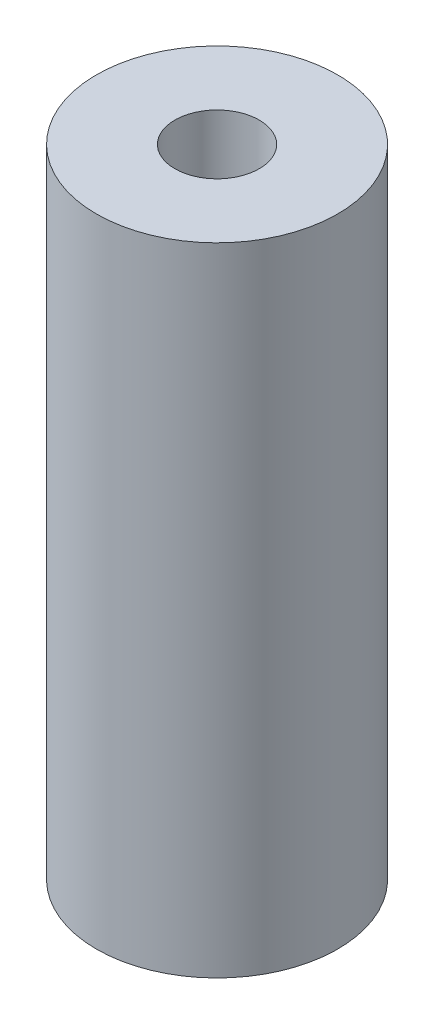
ISO-10303-21;
HEADER;
FILE_DESCRIPTION(('STEP AP214'),'2;1');
FILE_NAME('part.step','',(''),(''),'','','');
FILE_SCHEMA(('AUTOMOTIVE_DESIGN { 1 0 10303 214 1 1 1 1 }'));
ENDSEC;
DATA;
#1=APPLICATION_CONTEXT('core data for automotive mechanical design processes');
#2=APPLICATION_PROTOCOL_DEFINITION('international standard','automotive_design',2000,#1);
#3=PRODUCT_CONTEXT('',#1,'mechanical');
#4=PRODUCT('Part','Part','',(#3));
#5=PRODUCT_RELATED_PRODUCT_CATEGORY('part','',(#4));
#6=PRODUCT_DEFINITION_FORMATION('','',#4);
#7=PRODUCT_DEFINITION_CONTEXT('part definition',#1,'design');
#8=PRODUCT_DEFINITION('design','',#6,#7);
#9=PRODUCT_DEFINITION_SHAPE('','',#8);
#10=(LENGTH_UNIT() NAMED_UNIT(*) SI_UNIT(.MILLI.,.METRE.));
#11=(NAMED_UNIT(*) PLANE_ANGLE_UNIT() SI_UNIT($,.RADIAN.));
#12=(NAMED_UNIT(*) SI_UNIT($,.STERADIAN.) SOLID_ANGLE_UNIT());
#13=UNCERTAINTY_MEASURE_WITH_UNIT(LENGTH_MEASURE(1.E-05),#10,'distance_accuracy_value','');
#14=(GEOMETRIC_REPRESENTATION_CONTEXT(3) GLOBAL_UNCERTAINTY_ASSIGNED_CONTEXT((#13)) GLOBAL_UNIT_ASSIGNED_CONTEXT((#10,
#11,#12)) REPRESENTATION_CONTEXT('',''));
#15=CARTESIAN_POINT('',(0.,0.,0.));
#16=DIRECTION('',(0.,0.,1.));
#17=DIRECTION('',(1.,0.,0.));
#18=AXIS2_PLACEMENT_3D('',#15,#16,#17);
#19=CARTESIAN_POINT('',(0.,26.4,0.));
#20=DIRECTION('',(0.,1.,0.));
#21=DIRECTION('',(0.,0.,1.));
#22=AXIS2_PLACEMENT_3D('',#19,#20,#21);
#23=PLANE('',#22);
#24=CARTESIAN_POINT('',(0.,26.4,0.));
#25=DIRECTION('',(0.,1.,0.));
#26=DIRECTION('',(0.,0.,1.));
#27=AXIS2_PLACEMENT_3D('',#24,#25,#26);
#28=CIRCLE('',#27,5.);
#29=CARTESIAN_POINT('',(0.,26.4,5.));
#30=VERTEX_POINT('',#29);
#31=EDGE_CURVE('E10',#30,#30,#28,.T.);
#32=ORIENTED_EDGE('',*,*,#31,.T.);
#33=EDGE_LOOP('',(#32));
#34=FACE_BOUND('',#33,.T.);
#35=CARTESIAN_POINT('',(0.,26.4,0.));
#36=DIRECTION('',(0.,1.,0.));
#37=DIRECTION('',(0.,0.,1.));
#38=AXIS2_PLACEMENT_3D('',#35,#36,#37);
#39=CIRCLE('',#38,1.75);
#40=CARTESIAN_POINT('',(0.,26.4,1.75));
#41=VERTEX_POINT('',#40);
#42=EDGE_CURVE('E54',#41,#41,#39,.T.);
#43=ORIENTED_EDGE('',*,*,#42,.F.);
#44=EDGE_LOOP('',(#43));
#45=FACE_BOUND('',#44,.T.);
#46=ADVANCED_FACE('F41',(#34,#45),#23,.T.);
#47=CARTESIAN_POINT('',(0.,0.,0.));
#48=DIRECTION('',(0.,1.,0.));
#49=DIRECTION('',(0.,0.,1.));
#50=AXIS2_PLACEMENT_3D('',#47,#48,#49);
#51=PLANE('',#50);
#52=CARTESIAN_POINT('',(0.,0.,0.));
#53=DIRECTION('',(0.,1.,0.));
#54=DIRECTION('',(0.,0.,1.));
#55=AXIS2_PLACEMENT_3D('',#52,#53,#54);
#56=CIRCLE('',#55,5.);
#57=CARTESIAN_POINT('',(0.,0.,5.));
#58=VERTEX_POINT('',#57);
#59=EDGE_CURVE('E45',#58,#58,#56,.T.);
#60=ORIENTED_EDGE('',*,*,#59,.F.);
#61=EDGE_LOOP('',(#60));
#62=FACE_BOUND('',#61,.T.);
#63=CARTESIAN_POINT('',(0.,0.,0.));
#64=DIRECTION('',(0.,1.,0.));
#65=DIRECTION('',(0.,0.,1.));
#66=AXIS2_PLACEMENT_3D('',#63,#64,#65);
#67=CIRCLE('',#66,1.75);
#68=CARTESIAN_POINT('',(0.,0.,1.75));
#69=VERTEX_POINT('',#68);
#70=EDGE_CURVE('E56',#69,#69,#67,.T.);
#71=ORIENTED_EDGE('',*,*,#70,.T.);
#72=EDGE_LOOP('',(#71));
#73=FACE_BOUND('',#72,.T.);
#74=ADVANCED_FACE('F68',(#62,#73),#51,.F.);
#75=CARTESIAN_POINT('',(0.,26.4,0.));
#76=DIRECTION('',(0.,-1.,0.));
#77=DIRECTION('',(0.,0.,-1.));
#78=AXIS2_PLACEMENT_3D('',#75,#76,#77);
#79=CYLINDRICAL_SURFACE('',#78,5.);
#80=ORIENTED_EDGE('',*,*,#31,.F.);
#81=EDGE_LOOP('',(#80));
#82=FACE_BOUND('',#81,.T.);
#83=ORIENTED_EDGE('',*,*,#59,.T.);
#84=EDGE_LOOP('',(#83));
#85=FACE_BOUND('',#84,.T.);
#86=ADVANCED_FACE('F43',(#82,#85),#79,.T.);
#87=CARTESIAN_POINT('',(0.,26.4,0.));
#88=DIRECTION('',(0.,-1.,0.));
#89=DIRECTION('',(0.,0.,-1.));
#90=AXIS2_PLACEMENT_3D('',#87,#88,#89);
#91=CYLINDRICAL_SURFACE('',#90,1.75);
#92=ORIENTED_EDGE('',*,*,#42,.T.);
#93=EDGE_LOOP('',(#92));
#94=FACE_BOUND('',#93,.T.);
#95=ORIENTED_EDGE('',*,*,#70,.F.);
#96=EDGE_LOOP('',(#95));
#97=FACE_BOUND('',#96,.T.);
#98=ADVANCED_FACE('F64',(#94,#97),#91,.F.);
#99=CLOSED_SHELL('',(#46,#74,#86,#98));
#100=MANIFOLD_SOLID_BREP('B2',#99);
#101=ADVANCED_BREP_SHAPE_REPRESENTATION('',(#18,#100),#14);
#102=SHAPE_DEFINITION_REPRESENTATION(#9,#101);
ENDSEC;
END-ISO-10303-21;
